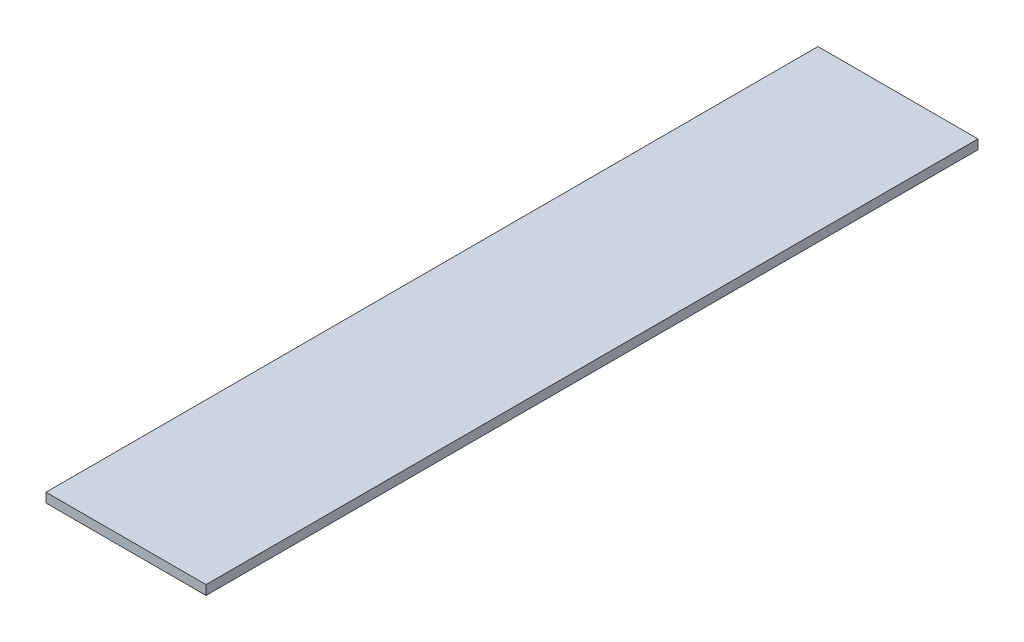
ISO-10303-21;
HEADER;
FILE_DESCRIPTION(('STEP AP214'),'2;1');
FILE_NAME('part.step','',(''),(''),'','','');
FILE_SCHEMA(('AUTOMOTIVE_DESIGN { 1 0 10303 214 1 1 1 1 }'));
ENDSEC;
DATA;
#1=APPLICATION_CONTEXT('core data for automotive mechanical design processes');
#2=APPLICATION_PROTOCOL_DEFINITION('international standard','automotive_design',2000,#1);
#3=PRODUCT_CONTEXT('',#1,'mechanical');
#4=PRODUCT('Part','Part','',(#3));
#5=PRODUCT_RELATED_PRODUCT_CATEGORY('part','',(#4));
#6=PRODUCT_DEFINITION_FORMATION('','',#4);
#7=PRODUCT_DEFINITION_CONTEXT('part definition',#1,'design');
#8=PRODUCT_DEFINITION('design','',#6,#7);
#9=PRODUCT_DEFINITION_SHAPE('','',#8);
#10=(LENGTH_UNIT() NAMED_UNIT(*) SI_UNIT(.MILLI.,.METRE.));
#11=(NAMED_UNIT(*) PLANE_ANGLE_UNIT() SI_UNIT($,.RADIAN.));
#12=(NAMED_UNIT(*) SI_UNIT($,.STERADIAN.) SOLID_ANGLE_UNIT());
#13=UNCERTAINTY_MEASURE_WITH_UNIT(LENGTH_MEASURE(1.E-05),#10,'distance_accuracy_value','');
#14=(GEOMETRIC_REPRESENTATION_CONTEXT(3) GLOBAL_UNCERTAINTY_ASSIGNED_CONTEXT((#13)) GLOBAL_UNIT_ASSIGNED_CONTEXT((#10,
#11,#12)) REPRESENTATION_CONTEXT('',''));
#15=CARTESIAN_POINT('',(0.,0.,0.));
#16=DIRECTION('',(0.,0.,1.));
#17=DIRECTION('',(1.,0.,0.));
#18=AXIS2_PLACEMENT_3D('',#15,#16,#17);
#19=CARTESIAN_POINT('',(0.,0.,-820.));
#20=DIRECTION('',(-1.,0.,0.));
#21=DIRECTION('',(0.,0.,1.));
#22=AXIS2_PLACEMENT_3D('',#19,#20,#21);
#23=PLANE('',#22);
#24=DIRECTION('',(0.,-1.,0.));
#25=VECTOR('',#24,1.);
#26=CARTESIAN_POINT('',(0.,0.,0.));
#27=LINE('',#26,#25);
#28=CARTESIAN_POINT('',(0.,10.,0.));
#29=VERTEX_POINT('',#28);
#30=CARTESIAN_POINT('',(0.,0.,0.));
#31=VERTEX_POINT('',#30);
#32=EDGE_CURVE('E99',#29,#31,#27,.T.);
#33=ORIENTED_EDGE('',*,*,#32,.F.);
#34=DIRECTION('',(0.,0.,1.));
#35=VECTOR('',#34,1.);
#36=CARTESIAN_POINT('',(0.,10.,-820.));
#37=LINE('',#36,#35);
#38=CARTESIAN_POINT('',(0.,10.,-820.));
#39=VERTEX_POINT('',#38);
#40=EDGE_CURVE('E11',#39,#29,#37,.T.);
#41=ORIENTED_EDGE('',*,*,#40,.F.);
#42=DIRECTION('',(0.,-1.,0.));
#43=VECTOR('',#42,1.);
#44=CARTESIAN_POINT('',(0.,0.,-820.));
#45=LINE('',#44,#43);
#46=CARTESIAN_POINT('',(0.,0.,-820.));
#47=VERTEX_POINT('',#46);
#48=EDGE_CURVE('E93',#39,#47,#45,.T.);
#49=ORIENTED_EDGE('',*,*,#48,.T.);
#50=DIRECTION('',(0.,0.,1.));
#51=VECTOR('',#50,1.);
#52=CARTESIAN_POINT('',(0.,0.,-820.));
#53=LINE('',#52,#51);
#54=EDGE_CURVE('E38',#47,#31,#53,.T.);
#55=ORIENTED_EDGE('',*,*,#54,.T.);
#56=EDGE_LOOP('',(#33,#41,#49,#55));
#57=FACE_BOUND('',#56,.T.);
#58=ADVANCED_FACE('F35',(#57),#23,.T.);
#59=CARTESIAN_POINT('',(0.,10.,-820.));
#60=DIRECTION('',(0.,1.,0.));
#61=DIRECTION('',(0.,0.,1.));
#62=AXIS2_PLACEMENT_3D('',#59,#60,#61);
#63=PLANE('',#62);
#64=DIRECTION('',(-1.,0.,0.));
#65=VECTOR('',#64,1.);
#66=CARTESIAN_POINT('',(0.,10.,0.));
#67=LINE('',#66,#65);
#68=CARTESIAN_POINT('',(170.,10.,0.));
#69=VERTEX_POINT('',#68);
#70=EDGE_CURVE('E95',#69,#29,#67,.T.);
#71=ORIENTED_EDGE('',*,*,#70,.F.);
#72=DIRECTION('',(0.,0.,1.));
#73=VECTOR('',#72,1.);
#74=CARTESIAN_POINT('',(170.,10.,-820.));
#75=LINE('',#74,#73);
#76=CARTESIAN_POINT('',(170.,10.,-820.));
#77=VERTEX_POINT('',#76);
#78=EDGE_CURVE('E44',#77,#69,#75,.T.);
#79=ORIENTED_EDGE('',*,*,#78,.F.);
#80=DIRECTION('',(-1.,0.,0.));
#81=VECTOR('',#80,1.);
#82=CARTESIAN_POINT('',(0.,10.,-820.));
#83=LINE('',#82,#81);
#84=EDGE_CURVE('E90',#77,#39,#83,.T.);
#85=ORIENTED_EDGE('',*,*,#84,.T.);
#86=ORIENTED_EDGE('',*,*,#40,.T.);
#87=EDGE_LOOP('',(#71,#79,#85,#86));
#88=FACE_BOUND('',#87,.T.);
#89=ADVANCED_FACE('F109',(#88),#63,.T.);
#90=CARTESIAN_POINT('',(170.,0.,-820.));
#91=DIRECTION('',(1.,0.,0.));
#92=DIRECTION('',(0.,0.,-1.));
#93=AXIS2_PLACEMENT_3D('',#90,#91,#92);
#94=PLANE('',#93);
#95=DIRECTION('',(0.,1.,0.));
#96=VECTOR('',#95,1.);
#97=CARTESIAN_POINT('',(170.,0.,0.));
#98=LINE('',#97,#96);
#99=CARTESIAN_POINT('',(170.,0.,0.));
#100=VERTEX_POINT('',#99);
#101=EDGE_CURVE('E85',#100,#69,#98,.T.);
#102=ORIENTED_EDGE('',*,*,#101,.F.);
#103=DIRECTION('',(0.,0.,1.));
#104=VECTOR('',#103,1.);
#105=CARTESIAN_POINT('',(170.,0.,-820.));
#106=LINE('',#105,#104);
#107=CARTESIAN_POINT('',(170.,0.,-820.));
#108=VERTEX_POINT('',#107);
#109=EDGE_CURVE('E80',#108,#100,#106,.T.);
#110=ORIENTED_EDGE('',*,*,#109,.F.);
#111=DIRECTION('',(0.,1.,0.));
#112=VECTOR('',#111,1.);
#113=CARTESIAN_POINT('',(170.,0.,-820.));
#114=LINE('',#113,#112);
#115=EDGE_CURVE('E83',#108,#77,#114,.T.);
#116=ORIENTED_EDGE('',*,*,#115,.T.);
#117=ORIENTED_EDGE('',*,*,#78,.T.);
#118=EDGE_LOOP('',(#102,#110,#116,#117));
#119=FACE_BOUND('',#118,.T.);
#120=ADVANCED_FACE('F82',(#119),#94,.T.);
#121=CARTESIAN_POINT('',(0.,0.,-820.));
#122=DIRECTION('',(0.,-1.,0.));
#123=DIRECTION('',(0.,0.,-1.));
#124=AXIS2_PLACEMENT_3D('',#121,#122,#123);
#125=PLANE('',#124);
#126=DIRECTION('',(1.,0.,0.));
#127=VECTOR('',#126,1.);
#128=CARTESIAN_POINT('',(0.,0.,0.));
#129=LINE('',#128,#127);
#130=EDGE_CURVE('E102',#31,#100,#129,.T.);
#131=ORIENTED_EDGE('',*,*,#130,.F.);
#132=ORIENTED_EDGE('',*,*,#54,.F.);
#133=DIRECTION('',(1.,0.,0.));
#134=VECTOR('',#133,1.);
#135=CARTESIAN_POINT('',(0.,0.,-820.));
#136=LINE('',#135,#134);
#137=EDGE_CURVE('E89',#47,#108,#136,.T.);
#138=ORIENTED_EDGE('',*,*,#137,.T.);
#139=ORIENTED_EDGE('',*,*,#109,.T.);
#140=EDGE_LOOP('',(#131,#132,#138,#139));
#141=FACE_BOUND('',#140,.T.);
#142=ADVANCED_FACE('F92',(#141),#125,.T.);
#143=CARTESIAN_POINT('',(0.,0.,-820.));
#144=DIRECTION('',(0.,0.,-1.));
#145=DIRECTION('',(-1.,0.,0.));
#146=AXIS2_PLACEMENT_3D('',#143,#144,#145);
#147=PLANE('',#146);
#148=ORIENTED_EDGE('',*,*,#48,.F.);
#149=ORIENTED_EDGE('',*,*,#84,.F.);
#150=ORIENTED_EDGE('',*,*,#115,.F.);
#151=ORIENTED_EDGE('',*,*,#137,.F.);
#152=EDGE_LOOP('',(#148,#149,#150,#151));
#153=FACE_BOUND('',#152,.T.);
#154=ADVANCED_FACE('F88',(#153),#147,.T.);
#155=CARTESIAN_POINT('',(0.,0.,0.));
#156=DIRECTION('',(0.,0.,-1.));
#157=DIRECTION('',(-1.,0.,0.));
#158=AXIS2_PLACEMENT_3D('',#155,#156,#157);
#159=PLANE('',#158);
#160=ORIENTED_EDGE('',*,*,#32,.T.);
#161=ORIENTED_EDGE('',*,*,#130,.T.);
#162=ORIENTED_EDGE('',*,*,#101,.T.);
#163=ORIENTED_EDGE('',*,*,#70,.T.);
#164=EDGE_LOOP('',(#160,#161,#162,#163));
#165=FACE_BOUND('',#164,.T.);
#166=ADVANCED_FACE('F108',(#165),#159,.F.);
#167=CLOSED_SHELL('',(#58,#89,#120,#142,#154,#166));
#168=MANIFOLD_SOLID_BREP('B2',#167);
#169=ADVANCED_BREP_SHAPE_REPRESENTATION('',(#18,#168),#14);
#170=SHAPE_DEFINITION_REPRESENTATION(#9,#169);
ENDSEC;
END-ISO-10303-21;
